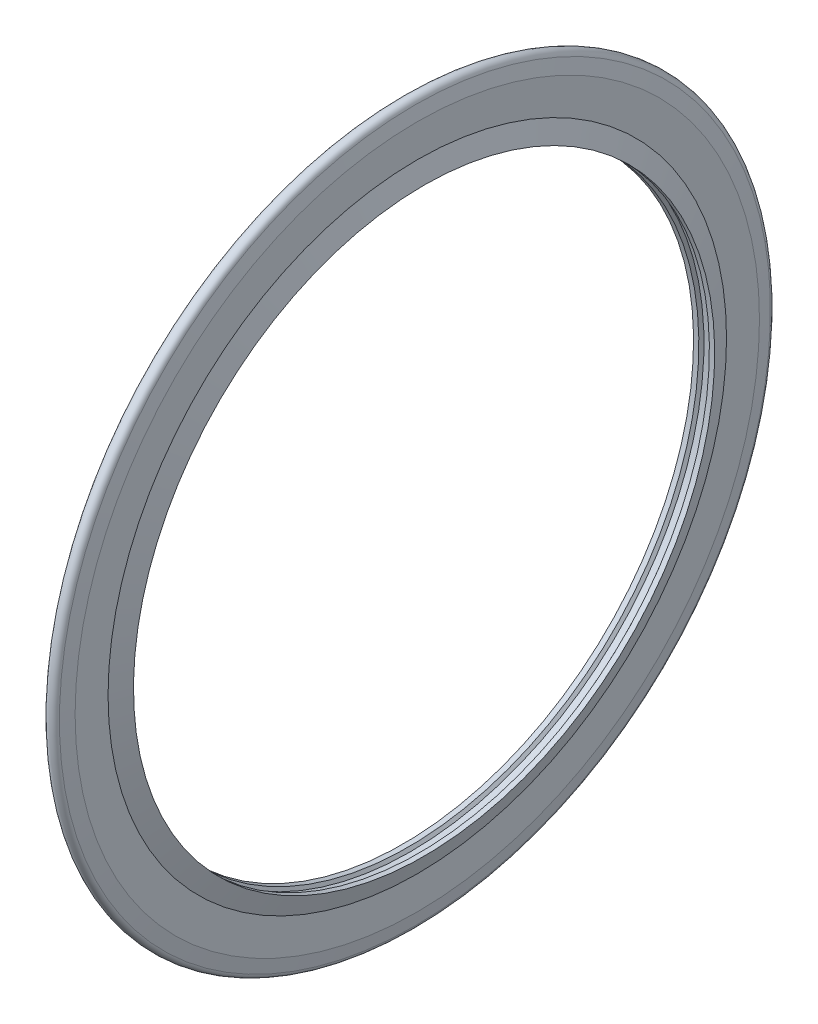
ISO-10303-21;
HEADER;
FILE_DESCRIPTION(('STEP AP214'),'2;1');
FILE_NAME('part.step','',(''),(''),'','','');
FILE_SCHEMA(('AUTOMOTIVE_DESIGN { 1 0 10303 214 1 1 1 1 }'));
ENDSEC;
DATA;
#1=APPLICATION_CONTEXT('core data for automotive mechanical design processes');
#2=APPLICATION_PROTOCOL_DEFINITION('international standard','automotive_design',2000,#1);
#3=PRODUCT_CONTEXT('',#1,'mechanical');
#4=PRODUCT('Part','Part','',(#3));
#5=PRODUCT_RELATED_PRODUCT_CATEGORY('part','',(#4));
#6=PRODUCT_DEFINITION_FORMATION('','',#4);
#7=PRODUCT_DEFINITION_CONTEXT('part definition',#1,'design');
#8=PRODUCT_DEFINITION('design','',#6,#7);
#9=PRODUCT_DEFINITION_SHAPE('','',#8);
#10=(LENGTH_UNIT() NAMED_UNIT(*) SI_UNIT(.MILLI.,.METRE.));
#11=(NAMED_UNIT(*) PLANE_ANGLE_UNIT() SI_UNIT($,.RADIAN.));
#12=(NAMED_UNIT(*) SI_UNIT($,.STERADIAN.) SOLID_ANGLE_UNIT());
#13=UNCERTAINTY_MEASURE_WITH_UNIT(LENGTH_MEASURE(1.E-05),#10,'distance_accuracy_value','');
#14=(GEOMETRIC_REPRESENTATION_CONTEXT(3) GLOBAL_UNCERTAINTY_ASSIGNED_CONTEXT((#13)) GLOBAL_UNIT_ASSIGNED_CONTEXT((#10,
#11,#12)) REPRESENTATION_CONTEXT('',''));
#15=CARTESIAN_POINT('',(0.,0.,0.));
#16=DIRECTION('',(0.,0.,1.));
#17=DIRECTION('',(1.,0.,0.));
#18=AXIS2_PLACEMENT_3D('',#15,#16,#17);
#19=CARTESIAN_POINT('',(0.3675,0.,0.));
#20=DIRECTION('',(-1.,0.,0.));
#21=DIRECTION('',(0.,1.,0.));
#22=AXIS2_PLACEMENT_3D('',#19,#20,#21);
#23=CONICAL_SURFACE('',#22,27.829275,0.785398163397451);
#24=CARTESIAN_POINT('',(0.49,0.,0.));
#25=DIRECTION('',(1.,0.,0.));
#26=DIRECTION('',(0.,1.,0.));
#27=AXIS2_PLACEMENT_3D('',#24,#25,#26);
#28=CIRCLE('',#27,27.706775);
#29=CARTESIAN_POINT('',(0.49,27.706775,0.));
#30=VERTEX_POINT('',#29);
#31=EDGE_CURVE('E11',#30,#30,#28,.T.);
#32=ORIENTED_EDGE('',*,*,#31,.T.);
#33=EDGE_LOOP('',(#32));
#34=FACE_BOUND('',#33,.T.);
#35=CARTESIAN_POINT('',(0.245,0.,0.));
#36=DIRECTION('',(1.,0.,0.));
#37=DIRECTION('',(0.,1.,0.));
#38=AXIS2_PLACEMENT_3D('',#35,#36,#37);
#39=CIRCLE('',#38,27.951775);
#40=CARTESIAN_POINT('',(0.245,27.951775,0.));
#41=VERTEX_POINT('',#40);
#42=EDGE_CURVE('E86',#41,#41,#39,.T.);
#43=ORIENTED_EDGE('',*,*,#42,.F.);
#44=EDGE_LOOP('',(#43));
#45=FACE_BOUND('',#44,.T.);
#46=ADVANCED_FACE('F16',(#34,#45),#23,.F.);
#47=CARTESIAN_POINT('',(0.49,26.22115,0.));
#48=DIRECTION('',(-1.,0.,0.));
#49=DIRECTION('',(0.,-1.,0.));
#50=AXIS2_PLACEMENT_3D('',#47,#48,#49);
#51=PLANE('',#50);
#52=CARTESIAN_POINT('',(0.49,0.,0.));
#53=DIRECTION('',(1.,0.,0.));
#54=DIRECTION('',(0.,1.,0.));
#55=AXIS2_PLACEMENT_3D('',#52,#53,#54);
#56=CIRCLE('',#55,24.735525);
#57=CARTESIAN_POINT('',(0.49,24.735525,0.));
#58=VERTEX_POINT('',#57);
#59=EDGE_CURVE('E26',#58,#58,#56,.T.);
#60=ORIENTED_EDGE('',*,*,#59,.T.);
#61=EDGE_LOOP('',(#60));
#62=FACE_BOUND('',#61,.T.);
#63=ORIENTED_EDGE('',*,*,#31,.F.);
#64=EDGE_LOOP('',(#63));
#65=FACE_BOUND('',#64,.T.);
#66=ADVANCED_FACE('F100',(#62,#65),#51,.T.);
#67=CARTESIAN_POINT('',(0.3675,0.,0.));
#68=DIRECTION('',(1.,0.,0.));
#69=DIRECTION('',(0.,1.,0.));
#70=AXIS2_PLACEMENT_3D('',#67,#68,#69);
#71=CONICAL_SURFACE('',#70,24.613025,0.785398163397443);
#72=CARTESIAN_POINT('',(0.245,0.,0.));
#73=DIRECTION('',(1.,0.,0.));
#74=DIRECTION('',(0.,1.,0.));
#75=AXIS2_PLACEMENT_3D('',#72,#73,#74);
#76=CIRCLE('',#75,24.490525);
#77=CARTESIAN_POINT('',(0.245,24.490525,0.));
#78=VERTEX_POINT('',#77);
#79=EDGE_CURVE('E81',#78,#78,#76,.T.);
#80=ORIENTED_EDGE('',*,*,#79,.T.);
#81=EDGE_LOOP('',(#80));
#82=FACE_BOUND('',#81,.T.);
#83=ORIENTED_EDGE('',*,*,#59,.F.);
#84=EDGE_LOOP('',(#83));
#85=FACE_BOUND('',#84,.T.);
#86=ADVANCED_FACE('F106',(#82,#85),#71,.T.);
#87=CARTESIAN_POINT('',(0.245,24.0522625,0.));
#88=DIRECTION('',(-1.,0.,0.));
#89=DIRECTION('',(0.,-1.,0.));
#90=AXIS2_PLACEMENT_3D('',#87,#88,#89);
#91=PLANE('',#90);
#92=CARTESIAN_POINT('',(0.245,0.,0.));
#93=DIRECTION('',(1.,0.,0.));
#94=DIRECTION('',(0.,1.,0.));
#95=AXIS2_PLACEMENT_3D('',#92,#93,#94);
#96=CIRCLE('',#95,23.614);
#97=CARTESIAN_POINT('',(0.245,23.614,0.));
#98=VERTEX_POINT('',#97);
#99=EDGE_CURVE('E79',#98,#98,#96,.T.);
#100=ORIENTED_EDGE('',*,*,#99,.T.);
#101=EDGE_LOOP('',(#100));
#102=FACE_BOUND('',#101,.T.);
#103=ORIENTED_EDGE('',*,*,#79,.F.);
#104=EDGE_LOOP('',(#103));
#105=FACE_BOUND('',#104,.T.);
#106=ADVANCED_FACE('F117',(#102,#105),#91,.T.);
#107=CARTESIAN_POINT('',(0.459375,0.,0.));
#108=DIRECTION('',(-1.,0.,0.));
#109=DIRECTION('',(0.,1.,0.));
#110=AXIS2_PLACEMENT_3D('',#107,#108,#109);
#111=CYLINDRICAL_SURFACE('',#110,23.614);
#112=CARTESIAN_POINT('',(0.67375,0.,0.));
#113=DIRECTION('',(1.,0.,0.));
#114=DIRECTION('',(0.,1.,0.));
#115=AXIS2_PLACEMENT_3D('',#112,#113,#114);
#116=CIRCLE('',#115,23.614);
#117=CARTESIAN_POINT('',(0.67375,23.614,0.));
#118=VERTEX_POINT('',#117);
#119=EDGE_CURVE('E82',#118,#118,#116,.T.);
#120=ORIENTED_EDGE('',*,*,#119,.T.);
#121=EDGE_LOOP('',(#120));
#122=FACE_BOUND('',#121,.T.);
#123=ORIENTED_EDGE('',*,*,#99,.F.);
#124=EDGE_LOOP('',(#123));
#125=FACE_BOUND('',#124,.T.);
#126=ADVANCED_FACE('F18',(#122,#125),#111,.F.);
#127=CARTESIAN_POINT('',(0.759525423430691,0.,0.));
#128=DIRECTION('',(1.,0.,0.));
#129=DIRECTION('',(0.,1.,0.));
#130=AXIS2_PLACEMENT_3D('',#127,#128,#129);
#131=CONICAL_SURFACE('',#130,23.7365,0.959931088596871);
#132=CARTESIAN_POINT('',(0.845300846861383,0.,0.));
#133=DIRECTION('',(1.,0.,0.));
#134=DIRECTION('',(0.,1.,0.));
#135=AXIS2_PLACEMENT_3D('',#132,#133,#134);
#136=CIRCLE('',#135,23.859);
#137=CARTESIAN_POINT('',(0.845300846861383,23.859,0.));
#138=VERTEX_POINT('',#137);
#139=EDGE_CURVE('E20',#138,#138,#136,.T.);
#140=ORIENTED_EDGE('',*,*,#139,.T.);
#141=EDGE_LOOP('',(#140));
#142=FACE_BOUND('',#141,.T.);
#143=ORIENTED_EDGE('',*,*,#119,.F.);
#144=EDGE_LOOP('',(#143));
#145=FACE_BOUND('',#144,.T.);
#146=ADVANCED_FACE('F115',(#142,#145),#131,.F.);
#147=CARTESIAN_POINT('',(1.1025,0.,0.));
#148=DIRECTION('',(-1.,0.,0.));
#149=DIRECTION('',(0.,1.,0.));
#150=AXIS2_PLACEMENT_3D('',#147,#148,#149);
#151=CYLINDRICAL_SURFACE('',#150,23.859);
#152=CARTESIAN_POINT('',(1.35969915313862,0.,0.));
#153=DIRECTION('',(1.,0.,0.));
#154=DIRECTION('',(0.,1.,0.));
#155=AXIS2_PLACEMENT_3D('',#152,#153,#154);
#156=CIRCLE('',#155,23.859);
#157=CARTESIAN_POINT('',(1.35969915313862,23.859,0.));
#158=VERTEX_POINT('',#157);
#159=EDGE_CURVE('E75',#158,#158,#156,.T.);
#160=ORIENTED_EDGE('',*,*,#159,.T.);
#161=EDGE_LOOP('',(#160));
#162=FACE_BOUND('',#161,.T.);
#163=ORIENTED_EDGE('',*,*,#139,.F.);
#164=EDGE_LOOP('',(#163));
#165=FACE_BOUND('',#164,.T.);
#166=ADVANCED_FACE('F111',(#162,#165),#151,.F.);
#167=CARTESIAN_POINT('',(1.44547457656931,0.,0.));
#168=DIRECTION('',(-1.,0.,0.));
#169=DIRECTION('',(0.,1.,0.));
#170=AXIS2_PLACEMENT_3D('',#167,#168,#169);
#171=CONICAL_SURFACE('',#170,23.7365,0.959931088596877);
#172=CARTESIAN_POINT('',(1.53125,0.,0.));
#173=DIRECTION('',(1.,0.,0.));
#174=DIRECTION('',(0.,1.,0.));
#175=AXIS2_PLACEMENT_3D('',#172,#173,#174);
#176=CIRCLE('',#175,23.614);
#177=CARTESIAN_POINT('',(1.53125,23.614,0.));
#178=VERTEX_POINT('',#177);
#179=EDGE_CURVE('E72',#178,#178,#176,.T.);
#180=ORIENTED_EDGE('',*,*,#179,.T.);
#181=EDGE_LOOP('',(#180));
#182=FACE_BOUND('',#181,.T.);
#183=ORIENTED_EDGE('',*,*,#159,.F.);
#184=EDGE_LOOP('',(#183));
#185=FACE_BOUND('',#184,.T.);
#186=ADVANCED_FACE('F114',(#182,#185),#171,.F.);
#187=CARTESIAN_POINT('',(1.745625,0.,0.));
#188=DIRECTION('',(-1.,0.,0.));
#189=DIRECTION('',(0.,1.,0.));
#190=AXIS2_PLACEMENT_3D('',#187,#188,#189);
#191=CYLINDRICAL_SURFACE('',#190,23.614);
#192=CARTESIAN_POINT('',(1.96,0.,0.));
#193=DIRECTION('',(1.,0.,0.));
#194=DIRECTION('',(0.,1.,0.));
#195=AXIS2_PLACEMENT_3D('',#192,#193,#194);
#196=CIRCLE('',#195,23.614);
#197=CARTESIAN_POINT('',(1.96,23.614,0.));
#198=VERTEX_POINT('',#197);
#199=EDGE_CURVE('E68',#198,#198,#196,.T.);
#200=ORIENTED_EDGE('',*,*,#199,.T.);
#201=EDGE_LOOP('',(#200));
#202=FACE_BOUND('',#201,.T.);
#203=ORIENTED_EDGE('',*,*,#179,.F.);
#204=EDGE_LOOP('',(#203));
#205=FACE_BOUND('',#204,.T.);
#206=ADVANCED_FACE('F69',(#202,#205),#191,.F.);
#207=CARTESIAN_POINT('',(1.684375,0.,0.));
#208=DIRECTION('',(-1.,0.,0.));
#209=DIRECTION('',(0.,1.,0.));
#210=AXIS2_PLACEMENT_3D('',#207,#208,#209);
#211=CONICAL_SURFACE('',#210,24.3712734637372,1.22173047639603);
#212=CARTESIAN_POINT('',(1.40875,0.,0.));
#213=DIRECTION('',(1.,0.,0.));
#214=DIRECTION('',(0.,1.,0.));
#215=AXIS2_PLACEMENT_3D('',#212,#213,#214);
#216=CIRCLE('',#215,25.1285469274743);
#217=CARTESIAN_POINT('',(1.40875,25.1285469274743,0.));
#218=VERTEX_POINT('',#217);
#219=EDGE_CURVE('E73',#218,#218,#216,.T.);
#220=ORIENTED_EDGE('',*,*,#219,.T.);
#221=EDGE_LOOP('',(#220));
#222=FACE_BOUND('',#221,.T.);
#223=ORIENTED_EDGE('',*,*,#199,.F.);
#224=EDGE_LOOP('',(#223));
#225=FACE_BOUND('',#224,.T.);
#226=ADVANCED_FACE('F123',(#222,#225),#211,.T.);
#227=CARTESIAN_POINT('',(1.40875,26.4665466691237,0.));
#228=DIRECTION('',(1.,0.,0.));
#229=DIRECTION('',(0.,1.,0.));
#230=AXIS2_PLACEMENT_3D('',#227,#228,#229);
#231=PLANE('',#230);
#232=CARTESIAN_POINT('',(1.40875,0.,0.));
#233=DIRECTION('',(1.,0.,0.));
#234=DIRECTION('',(0.,1.,0.));
#235=AXIS2_PLACEMENT_3D('',#232,#233,#234);
#236=CIRCLE('',#235,27.804546410773);
#237=CARTESIAN_POINT('',(1.40875,27.804546410773,0.));
#238=VERTEX_POINT('',#237);
#239=EDGE_CURVE('E77',#238,#238,#236,.T.);
#240=ORIENTED_EDGE('',*,*,#239,.T.);
#241=EDGE_LOOP('',(#240));
#242=FACE_BOUND('',#241,.T.);
#243=ORIENTED_EDGE('',*,*,#219,.F.);
#244=EDGE_LOOP('',(#243));
#245=FACE_BOUND('',#244,.T.);
#246=ADVANCED_FACE('F136',(#242,#245),#231,.T.);
#247=CARTESIAN_POINT('',(1.31315289948799,0.,0.));
#248=DIRECTION('',(-1.,0.,0.));
#249=DIRECTION('',(0.,1.,0.));
#250=AXIS2_PLACEMENT_3D('',#247,#248,#249);
#251=CONICAL_SURFACE('',#250,28.3467045089149,1.39626340159546);
#252=CARTESIAN_POINT('',(1.21755579897598,0.,0.));
#253=DIRECTION('',(1.,0.,0.));
#254=DIRECTION('',(0.,1.,0.));
#255=AXIS2_PLACEMENT_3D('',#252,#253,#254);
#256=CIRCLE('',#255,28.8888626070568);
#257=CARTESIAN_POINT('',(1.21755579897598,28.8888626070568,0.));
#258=VERTEX_POINT('',#257);
#259=EDGE_CURVE('E84',#258,#258,#256,.T.);
#260=ORIENTED_EDGE('',*,*,#259,.T.);
#261=EDGE_LOOP('',(#260));
#262=FACE_BOUND('',#261,.T.);
#263=ORIENTED_EDGE('',*,*,#239,.F.);
#264=EDGE_LOOP('',(#263));
#265=FACE_BOUND('',#264,.T.);
#266=ADVANCED_FACE('F129',(#262,#265),#251,.T.);
#267=CARTESIAN_POINT('',(0.735,0.,0.));
#268=DIRECTION('',(1.,0.,0.));
#269=DIRECTION('',(0.,0.,-1.));
#270=AXIS2_PLACEMENT_3D('',#267,#268,#269);
#271=TOROIDAL_SURFACE('',#270,28.803775,0.49);
#272=CARTESIAN_POINT('',(0.245,0.,0.));
#273=DIRECTION('',(1.,0.,0.));
#274=DIRECTION('',(0.,1.,0.));
#275=AXIS2_PLACEMENT_3D('',#272,#273,#274);
#276=CIRCLE('',#275,28.803775);
#277=CARTESIAN_POINT('',(0.245,28.803775,0.));
#278=VERTEX_POINT('',#277);
#279=EDGE_CURVE('E87',#278,#278,#276,.T.);
#280=ORIENTED_EDGE('',*,*,#279,.T.);
#281=EDGE_LOOP('',(#280));
#282=FACE_BOUND('',#281,.T.);
#283=ORIENTED_EDGE('',*,*,#259,.F.);
#284=EDGE_LOOP('',(#283));
#285=FACE_BOUND('',#284,.T.);
#286=ADVANCED_FACE('F127',(#282,#285),#271,.T.);
#287=CARTESIAN_POINT('',(0.245,28.377775,0.));
#288=DIRECTION('',(-1.,0.,0.));
#289=DIRECTION('',(0.,-1.,0.));
#290=AXIS2_PLACEMENT_3D('',#287,#288,#289);
#291=PLANE('',#290);
#292=ORIENTED_EDGE('',*,*,#42,.T.);
#293=EDGE_LOOP('',(#292));
#294=FACE_BOUND('',#293,.T.);
#295=ORIENTED_EDGE('',*,*,#279,.F.);
#296=EDGE_LOOP('',(#295));
#297=FACE_BOUND('',#296,.T.);
#298=ADVANCED_FACE('F96',(#294,#297),#291,.T.);
#299=CLOSED_SHELL('',(#46,#66,#86,#106,#126,#146,#166,#186,#206,#226,#246,#266,#286,#298));
#300=MANIFOLD_SOLID_BREP('B1',#299);
#301=ADVANCED_BREP_SHAPE_REPRESENTATION('',(#18,#300),#14);
#302=SHAPE_DEFINITION_REPRESENTATION(#9,#301);
ENDSEC;
END-ISO-10303-21;
